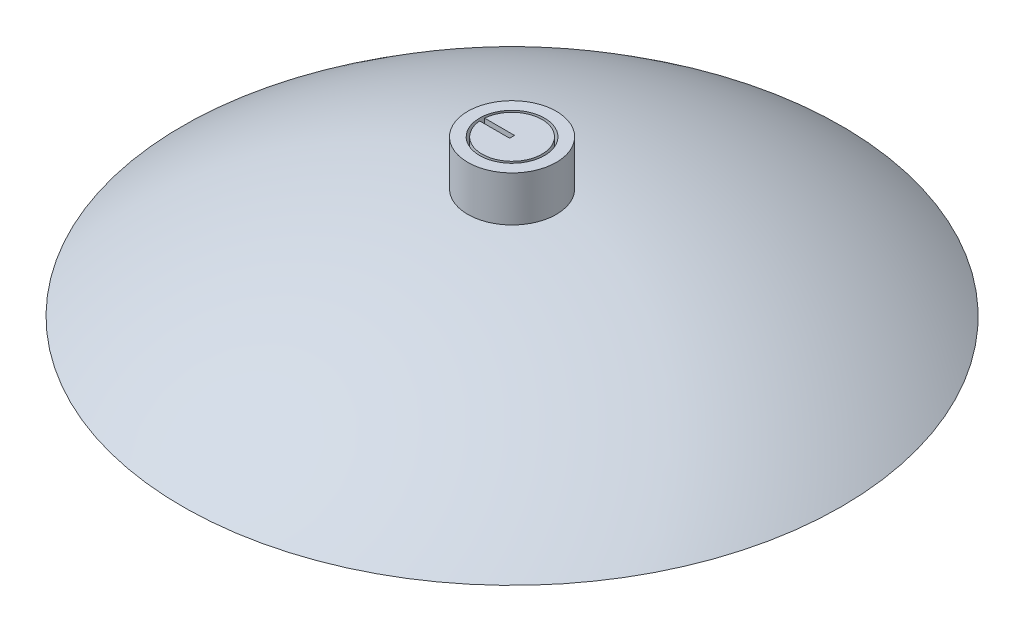
ISO-10303-21;
HEADER;
FILE_DESCRIPTION(('STEP AP214'),'2;1');
FILE_NAME('part.step','',(''),(''),'','','');
FILE_SCHEMA(('AUTOMOTIVE_DESIGN { 1 0 10303 214 1 1 1 1 }'));
ENDSEC;
DATA;
#1=APPLICATION_CONTEXT('core data for automotive mechanical design processes');
#2=APPLICATION_PROTOCOL_DEFINITION('international standard','automotive_design',2000,#1);
#3=PRODUCT_CONTEXT('',#1,'mechanical');
#4=PRODUCT('Part','Part','',(#3));
#5=PRODUCT_RELATED_PRODUCT_CATEGORY('part','',(#4));
#6=PRODUCT_DEFINITION_FORMATION('','',#4);
#7=PRODUCT_DEFINITION_CONTEXT('part definition',#1,'design');
#8=PRODUCT_DEFINITION('design','',#6,#7);
#9=PRODUCT_DEFINITION_SHAPE('','',#8);
#10=(LENGTH_UNIT() NAMED_UNIT(*) SI_UNIT(.MILLI.,.METRE.));
#11=(NAMED_UNIT(*) PLANE_ANGLE_UNIT() SI_UNIT($,.RADIAN.));
#12=(NAMED_UNIT(*) SI_UNIT($,.STERADIAN.) SOLID_ANGLE_UNIT());
#13=UNCERTAINTY_MEASURE_WITH_UNIT(LENGTH_MEASURE(1.E-05),#10,'distance_accuracy_value','');
#14=(GEOMETRIC_REPRESENTATION_CONTEXT(3) GLOBAL_UNCERTAINTY_ASSIGNED_CONTEXT((#13)) GLOBAL_UNIT_ASSIGNED_CONTEXT((#10,
#11,#12)) REPRESENTATION_CONTEXT('',''));
#15=CARTESIAN_POINT('',(0.,0.,0.));
#16=DIRECTION('',(0.,0.,1.));
#17=DIRECTION('',(1.,0.,0.));
#18=AXIS2_PLACEMENT_3D('',#15,#16,#17);
#19=CARTESIAN_POINT('',(0.,-276.361469298246,0.));
#20=DIRECTION('',(0.,1.,0.));
#21=DIRECTION('',(1.,0.,0.));
#22=AXIS2_PLACEMENT_3D('',#19,#20,#21);
#23=SPHERICAL_SURFACE('',#22,348.751469298246);
#24=CARTESIAN_POINT('',(0.,71.2173803354528,0.));
#25=DIRECTION('',(0.,-1.,0.));
#26=DIRECTION('',(0.,0.,-1.));
#27=AXIS2_PLACEMENT_3D('',#24,#25,#26);
#28=CIRCLE('',#27,28.575);
#29=CARTESIAN_POINT('',(28.5749999999997,71.2173803354528,0.));
#30=VERTEX_POINT('',#29);
#31=EDGE_CURVE('E122',#30,#30,#28,.F.);
#32=CARTESIAN_POINT('',(0.,0.,0.));
#33=DIRECTION('',(0.,1.,0.));
#34=DIRECTION('',(0.,0.,1.));
#35=AXIS2_PLACEMENT_3D('',#32,#33,#34);
#36=CIRCLE('',#35,212.725);
#37=CARTESIAN_POINT('',(212.725,0.,0.));
#38=VERTEX_POINT('',#37);
#39=EDGE_CURVE('E46',#38,#38,#36,.T.);
#40=CARTESIAN_POINT('',(28.5749999999997,71.2173803354528,0.));
#41=CARTESIAN_POINT('',(30.6531778594528,71.0465322560719,0.));
#42=CARTESIAN_POINT('',(32.7298230313158,70.8570417837193,0.));
#43=CARTESIAN_POINT('',(36.8793808310399,70.4408464603028,0.));
#44=CARTESIAN_POINT('',(38.9522934589011,70.214141609239,0.));
#45=CARTESIAN_POINT('',(43.0937190018005,69.7235879356326,0.));
#46=CARTESIAN_POINT('',(45.1622319168386,69.45973911309,0.));
#47=CARTESIAN_POINT('',(49.2941926025545,68.894983062168,0.));
#48=CARTESIAN_POINT('',(51.3576403732322,68.5940758337886,0.));
#49=CARTESIAN_POINT('',(55.4788068820728,67.9552995999625,0.));
#50=CARTESIAN_POINT('',(57.5365256202357,67.6174305945159,0.));
#51=CARTESIAN_POINT('',(61.6455720421874,66.9048395573153,0.));
#52=CARTESIAN_POINT('',(63.6968997259762,66.5301175255614,0.));
#53=CARTESIAN_POINT('',(67.7925040673146,65.743940981457,0.));
#54=CARTESIAN_POINT('',(69.836780724864,65.3324864691066,0.));
#55=CARTESIAN_POINT('',(73.9176253120332,64.4729773439427,0.));
#56=CARTESIAN_POINT('',(75.9541932416528,64.0249227311291,0.));
#57=CARTESIAN_POINT('',(80.0189651509447,63.0923575560364,0.));
#58=CARTESIAN_POINT('',(82.0471691306169,62.6078469937572,0.));
#59=CARTESIAN_POINT('',(86.0945606090364,61.6025258008354,0.));
#60=CARTESIAN_POINT('',(88.1137481077837,61.0817151701927,0.));
#61=CARTESIAN_POINT('',(92.1424569942027,60.0039614000942,0.));
#62=CARTESIAN_POINT('',(94.1519783818744,59.4470182606383,0.));
#63=CARTESIAN_POINT('',(98.1607085258635,58.2971786574064,0.));
#64=CARTESIAN_POINT('',(100.159917282181,57.7042821936303,0.));
#65=CARTESIAN_POINT('',(104.147378961047,56.4827266934367,0.));
#66=CARTESIAN_POINT('',(106.135631883597,55.8540676570193,0.));
#67=CARTESIAN_POINT('',(110.100542217318,54.5611892690666,0.));
#68=CARTESIAN_POINT('',(112.07719962849,53.8969699175312,0.));
#69=CARTESIAN_POINT('',(116.018282992453,52.5331845976309,0.));
#70=CARTESIAN_POINT('',(117.982708945244,51.8336186292659,0.));
#71=CARTESIAN_POINT('',(121.898697380652,50.3993651460088,0.));
#72=CARTESIAN_POINT('',(123.850259863269,49.6646776311166,0.));
#73=CARTESIAN_POINT('',(127.739893485077,48.1604174247093,0.));
#74=CARTESIAN_POINT('',(129.677964624269,47.3908447331942,0.));
#75=CARTESIAN_POINT('',(133.539992026529,45.8170617670007,0.));
#76=CARTESIAN_POINT('',(135.463948289596,45.0128514923223,0.));
#77=CARTESIAN_POINT('',(139.297126948064,43.370052097159,0.));
#78=CARTESIAN_POINT('',(141.206349343465,42.5314629766741,0.));
#79=CARTESIAN_POINT('',(145.009446015362,40.8201756879091,0.));
#80=CARTESIAN_POINT('',(146.903320291859,39.947477519629,0.));
#81=CARTESIAN_POINT('',(150.675111412637,38.1682529071359,0.));
#82=CARTESIAN_POINT('',(152.553028256919,37.261726462923,0.));
#83=CARTESIAN_POINT('',(156.29230033392,35.4151369539516,0.));
#84=CARTESIAN_POINT('',(158.15365556664,34.4750738891933,0.));
#85=CARTESIAN_POINT('',(161.859205569501,32.5617135841864,0.));
#86=CARTESIAN_POINT('',(163.703400339641,31.588416343938,0.));
#87=CARTESIAN_POINT('',(167.374036087384,29.6089008254561,0.));
#88=CARTESIAN_POINT('',(169.200477064987,28.6026825472226,0.));
#89=CARTESIAN_POINT('',(172.835017609409,26.5576486816549,0.));
#90=CARTESIAN_POINT('',(174.643117176227,25.5188330943207,0.));
#91=CARTESIAN_POINT('',(178.240393182499,23.4089388278772,0.));
#92=CARTESIAN_POINT('',(180.029569621952,22.3378601487678,0.));
#93=CARTESIAN_POINT('',(183.588423742366,20.1637842924782,0.));
#94=CARTESIAN_POINT('',(185.358101423327,19.060787115298,0.));
#95=CARTESIAN_POINT('',(188.877388678839,16.8232291390114,0.));
#96=CARTESIAN_POINT('',(190.62699825339,15.6886683399049,0.));
#97=CARTESIAN_POINT('',(194.105586367696,13.3883481010035,0.));
#98=CARTESIAN_POINT('',(195.834564907451,12.2225886612086,0.));
#99=CARTESIAN_POINT('',(199.271334799261,9.8602463456022,0.));
#100=CARTESIAN_POINT('',(200.979126151315,8.66366346979066,0.));
#101=CARTESIAN_POINT('',(204.372971816738,6.24005870965359,0.));
#102=CARTESIAN_POINT('',(206.059026130106,5.01303682532807,0.));
#103=CARTESIAN_POINT('',(209.408856781112,2.52895085860626,0.));
#104=CARTESIAN_POINT('',(211.07263311875,1.27188677620999,0.));
#105=CARTESIAN_POINT('',(212.725,0.,0.));
#106=B_SPLINE_CURVE_WITH_KNOTS('',3,(#40,#41,#42,#43,#44,#45,#46,#47,#48,#49,#50,#51,#52,#53,
#54,#55,#56,#57,#58,#59,#60,#61,#62,#63,#64,#65,#66,#67,#68,#69,#70,#71,#72,#73,#74,#75,#76,#77,
#78,#79,#80,#81,#82,#83,#84,#85,#86,#87,#88,#89,#90,#91,#92,#93,#94,#95,#96,#97,#98,#99,#100,
#101,#102,#103,#104,#105),.UNSPECIFIED.,.F.,.F.,(4,2,2,2,2,2,2,2,2,2,2,2,2,2,2,2,2,2,2,2,2,2,2,
2,2,2,2,2,2,2,2,2,4),(0.,6.25548239144599,12.510964782892,18.7664471743381,25.0219295657841,
31.27741195723,37.5328943486761,43.7883767401221,50.0438591315681,56.2993415230141,
62.5548239144601,68.8103063059062,75.0657886973522,81.3212710887981,87.5767534802442,
93.8322358716902,100.087718263136,106.343200654582,112.598683046028,118.854165437474,
125.10964782892,131.365130220366,137.620612611812,143.876095003258,150.131577394704,
156.38705978615,162.642542177596,168.898024569042,175.153506960488,181.408989351934,
187.66447174338,193.919954134826,200.175436526272),.UNSPECIFIED.);
#107=EDGE_CURVE('BSEAM38',#30,#38,#106,.T.);
#108=ORIENTED_EDGE('',*,*,#31,.F.);
#109=ORIENTED_EDGE('',*,*,#39,.T.);
#110=ORIENTED_EDGE('',*,*,#107,.T.);
#111=ORIENTED_EDGE('',*,*,#107,.F.);
#112=EDGE_LOOP('',(#108,#110,#109,#111));
#113=FACE_BOUND('',#112,.T.);
#114=ADVANCED_FACE('F38',(#113),#23,.T.);
#115=CARTESIAN_POINT('',(0.,-297.817589299627,0.));
#116=DIRECTION('',(0.,1.,0.));
#117=DIRECTION('',(0.,0.,1.));
#118=AXIS2_PLACEMENT_3D('',#115,#116,#117);
#119=DEGENERATE_TOROIDAL_SURFACE('',#118,9.66249287717544,348.751469298246,.T.);
#120=CARTESIAN_POINT('',(0.,50.9236017999871,0.));
#121=DIRECTION('',(0.,-1.,0.));
#122=DIRECTION('',(0.,0.,-1.));
#123=AXIS2_PLACEMENT_3D('',#120,#121,#122);
#124=CIRCLE('',#123,6.985);
#125=CARTESIAN_POINT('',(0.,50.9236017999871,6.985));
#126=VERTEX_POINT('',#125);
#127=EDGE_CURVE('E41',#126,#126,#124,.F.);
#128=ORIENTED_EDGE('',*,*,#127,.T.);
#129=EDGE_LOOP('',(#128));
#130=FACE_BOUND('',#129,.T.);
#131=CARTESIAN_POINT('',(0.,0.,0.));
#132=DIRECTION('',(0.,1.,0.));
#133=DIRECTION('',(0.,0.,1.));
#134=AXIS2_PLACEMENT_3D('',#131,#132,#133);
#135=CIRCLE('',#134,191.135);
#136=CARTESIAN_POINT('',(0.,0.,191.135));
#137=VERTEX_POINT('',#136);
#138=EDGE_CURVE('E11',#137,#137,#135,.T.);
#139=ORIENTED_EDGE('',*,*,#138,.F.);
#140=EDGE_LOOP('',(#139));
#141=FACE_BOUND('',#140,.T.);
#142=ADVANCED_FACE('F133',(#130,#141),#119,.F.);
#143=CARTESIAN_POINT('',(212.725,0.,0.));
#144=DIRECTION('',(0.,1.,0.));
#145=DIRECTION('',(0.,0.,1.));
#146=AXIS2_PLACEMENT_3D('',#143,#144,#145);
#147=PLANE('',#146);
#148=ORIENTED_EDGE('',*,*,#39,.F.);
#149=EDGE_LOOP('',(#148));
#150=FACE_BOUND('',#149,.T.);
#151=ORIENTED_EDGE('',*,*,#138,.T.);
#152=EDGE_LOOP('',(#151));
#153=FACE_BOUND('',#152,.T.);
#154=ADVANCED_FACE('F129',(#150,#153),#147,.F.);
#155=CARTESIAN_POINT('',(0.,100.33,0.));
#156=DIRECTION('',(0.,1.,0.));
#157=DIRECTION('',(0.,0.,1.));
#158=AXIS2_PLACEMENT_3D('',#155,#156,#157);
#159=PLANE('',#158);
#160=CARTESIAN_POINT('',(0.,100.33,0.));
#161=DIRECTION('',(0.,1.,0.));
#162=DIRECTION('',(0.,0.,1.));
#163=AXIS2_PLACEMENT_3D('',#160,#161,#162);
#164=CIRCLE('',#163,20.955);
#165=CARTESIAN_POINT('',(0.,100.33,20.955));
#166=VERTEX_POINT('',#165);
#167=EDGE_CURVE('E110',#166,#166,#164,.T.);
#168=ORIENTED_EDGE('',*,*,#167,.F.);
#169=EDGE_LOOP('',(#168));
#170=FACE_BOUND('',#169,.T.);
#171=CARTESIAN_POINT('',(0.,100.33,0.));
#172=DIRECTION('',(0.,1.,0.));
#173=DIRECTION('',(0.,0.,1.));
#174=AXIS2_PLACEMENT_3D('',#171,#172,#173);
#175=CIRCLE('',#174,28.575);
#176=CARTESIAN_POINT('',(0.,100.33,28.575));
#177=VERTEX_POINT('',#176);
#178=EDGE_CURVE('E117',#177,#177,#175,.T.);
#179=ORIENTED_EDGE('',*,*,#178,.T.);
#180=EDGE_LOOP('',(#179));
#181=FACE_BOUND('',#180,.T.);
#182=ADVANCED_FACE('F132',(#170,#181),#159,.T.);
#183=CARTESIAN_POINT('',(0.,-625.113938596491,0.));
#184=DIRECTION('',(0.,1.,0.));
#185=DIRECTION('',(0.,0.,1.));
#186=AXIS2_PLACEMENT_3D('',#183,#184,#185);
#187=CYLINDRICAL_SURFACE('',#186,28.575);
#188=ORIENTED_EDGE('',*,*,#178,.F.);
#189=EDGE_LOOP('',(#188));
#190=FACE_BOUND('',#189,.T.);
#191=ORIENTED_EDGE('',*,*,#31,.T.);
#192=EDGE_LOOP('',(#191));
#193=FACE_BOUND('',#192,.T.);
#194=ADVANCED_FACE('F145',(#190,#193),#187,.T.);
#195=CARTESIAN_POINT('',(0.,-0.001000000000001,0.));
#196=DIRECTION('',(0.,1.,0.));
#197=DIRECTION('',(0.,0.,1.));
#198=AXIS2_PLACEMENT_3D('',#195,#196,#197);
#199=CYLINDRICAL_SURFACE('',#198,20.955);
#200=ORIENTED_EDGE('',*,*,#167,.T.);
#201=EDGE_LOOP('',(#200));
#202=FACE_BOUND('',#201,.T.);
#203=CARTESIAN_POINT('',(0.,71.7598821191662,0.));
#204=DIRECTION('',(0.,-1.,0.));
#205=DIRECTION('',(0.,0.,-1.));
#206=AXIS2_PLACEMENT_3D('',#203,#204,#205);
#207=CIRCLE('',#206,20.955);
#208=CARTESIAN_POINT('',(0.,71.7598821191662,-20.955));
#209=VERTEX_POINT('',#208);
#210=EDGE_CURVE('E109',#209,#209,#207,.F.);
#211=ORIENTED_EDGE('',*,*,#210,.F.);
#212=EDGE_LOOP('',(#211));
#213=FACE_BOUND('',#212,.T.);
#214=ADVANCED_FACE('F148',(#202,#213),#199,.F.);
#215=CARTESIAN_POINT('',(0.,-0.001000000000001,0.));
#216=DIRECTION('',(0.,1.,0.));
#217=DIRECTION('',(0.,0.,1.));
#218=AXIS2_PLACEMENT_3D('',#215,#216,#217);
#219=CYLINDRICAL_SURFACE('',#218,19.3675);
#220=DIRECTION('',(0.,1.,0.));
#221=VECTOR('',#220,1.);
#222=CARTESIAN_POINT('',(-19.3023288750347,-0.001000000000001,1.58750000000001));
#223=LINE('',#222,#221);
#224=CARTESIAN_POINT('',(-19.3023288750347,71.8518091410396,1.58750000000001));
#225=VERTEX_POINT('',#224);
#226=CARTESIAN_POINT('',(-19.3023288750347,100.33,1.58750000000001));
#227=VERTEX_POINT('',#226);
#228=EDGE_CURVE('E62',#225,#227,#223,.T.);
#229=ORIENTED_EDGE('',*,*,#228,.F.);
#230=CARTESIAN_POINT('',(0.,71.8518091410395,0.));
#231=DIRECTION('',(0.,-1.,0.));
#232=DIRECTION('',(0.,0.,-1.));
#233=AXIS2_PLACEMENT_3D('',#230,#231,#232);
#234=CIRCLE('',#233,19.3675);
#235=CARTESIAN_POINT('',(-19.3023288750347,71.8518091410396,-1.5875));
#236=VERTEX_POINT('',#235);
#237=EDGE_CURVE('E95',#225,#236,#234,.F.);
#238=ORIENTED_EDGE('',*,*,#237,.T.);
#239=DIRECTION('',(0.,1.,0.));
#240=VECTOR('',#239,1.);
#241=CARTESIAN_POINT('',(-19.3023288750347,-0.001000000000001,-1.5875));
#242=LINE('',#241,#240);
#243=CARTESIAN_POINT('',(-19.3023288750347,100.33,-1.5875));
#244=VERTEX_POINT('',#243);
#245=EDGE_CURVE('E103',#236,#244,#242,.T.);
#246=ORIENTED_EDGE('',*,*,#245,.T.);
#247=CARTESIAN_POINT('',(0.,100.33,0.));
#248=DIRECTION('',(0.,1.,0.));
#249=DIRECTION('',(0.,0.,1.));
#250=AXIS2_PLACEMENT_3D('',#247,#248,#249);
#251=CIRCLE('',#250,19.3675);
#252=EDGE_CURVE('E113',#227,#244,#251,.T.);
#253=ORIENTED_EDGE('',*,*,#252,.F.);
#254=EDGE_LOOP('',(#229,#238,#246,#253));
#255=FACE_BOUND('',#254,.T.);
#256=ADVANCED_FACE('F156',(#255),#219,.T.);
#257=CARTESIAN_POINT('',(0.,-276.361469298246,0.));
#258=DIRECTION('',(0.,1.,0.));
#259=DIRECTION('',(1.,0.,0.));
#260=AXIS2_PLACEMENT_3D('',#257,#258,#259);
#261=SPHERICAL_SURFACE('',#260,348.751469298246);
#262=ORIENTED_EDGE('',*,*,#210,.T.);
#263=EDGE_LOOP('',(#262));
#264=FACE_BOUND('',#263,.T.);
#265=ORIENTED_EDGE('',*,*,#237,.F.);
#266=CARTESIAN_POINT('',(0.,-276.361469298246,1.5875));
#267=DIRECTION('',(0.,0.,1.));
#268=DIRECTION('',(1.,0.,0.));
#269=AXIS2_PLACEMENT_3D('',#266,#267,#268);
#270=CIRCLE('',#269,348.747856167511);
#271=CARTESIAN_POINT('',(0.,72.3863868692657,1.5875));
#272=VERTEX_POINT('',#271);
#273=EDGE_CURVE('E78',#225,#272,#270,.F.);
#274=ORIENTED_EDGE('',*,*,#273,.T.);
#275=CARTESIAN_POINT('',(0.,-276.361469298246,0.));
#276=DIRECTION('',(1.,0.,0.));
#277=DIRECTION('',(0.,0.,-1.));
#278=AXIS2_PLACEMENT_3D('',#275,#276,#277);
#279=CIRCLE('',#278,348.751469298246);
#280=CARTESIAN_POINT('',(0.,72.3863868692657,-1.5875));
#281=VERTEX_POINT('',#280);
#282=EDGE_CURVE('E82',#272,#281,#279,.F.);
#283=ORIENTED_EDGE('',*,*,#282,.T.);
#284=CARTESIAN_POINT('',(0.,-276.361469298246,-1.5875));
#285=DIRECTION('',(0.,0.,-1.));
#286=DIRECTION('',(-1.,0.,0.));
#287=AXIS2_PLACEMENT_3D('',#284,#285,#286);
#288=CIRCLE('',#287,348.747856167511);
#289=EDGE_CURVE('E102',#281,#236,#288,.F.);
#290=ORIENTED_EDGE('',*,*,#289,.T.);
#291=EDGE_LOOP('',(#265,#274,#283,#290));
#292=FACE_BOUND('',#291,.T.);
#293=ADVANCED_FACE('F93',(#264,#292),#261,.T.);
#294=DIRECTION('',(1.,0.,0.));
#295=VECTOR('',#294,1.);
#296=CARTESIAN_POINT('',(0.,100.33,1.5875));
#297=LINE('',#296,#295);
#298=CARTESIAN_POINT('',(0.,100.33,1.5875));
#299=VERTEX_POINT('',#298);
#300=EDGE_CURVE('E90',#227,#299,#297,.T.);
#301=ORIENTED_EDGE('',*,*,#300,.F.);
#302=ORIENTED_EDGE('',*,*,#252,.T.);
#303=DIRECTION('',(-1.,0.,0.));
#304=VECTOR('',#303,1.);
#305=CARTESIAN_POINT('',(-19.3023288750347,100.33,-1.5875));
#306=LINE('',#305,#304);
#307=CARTESIAN_POINT('',(0.,100.33,-1.5875));
#308=VERTEX_POINT('',#307);
#309=EDGE_CURVE('E96',#308,#244,#306,.T.);
#310=ORIENTED_EDGE('',*,*,#309,.F.);
#311=DIRECTION('',(0.,0.,-1.));
#312=VECTOR('',#311,1.);
#313=CARTESIAN_POINT('',(0.,100.33,-1.5875));
#314=LINE('',#313,#312);
#315=EDGE_CURVE('E53',#299,#308,#314,.T.);
#316=ORIENTED_EDGE('',*,*,#315,.F.);
#317=EDGE_LOOP('',(#301,#302,#310,#316));
#318=FACE_BOUND('',#317,.T.);
#319=ADVANCED_FACE('F153',(#318),#159,.T.);
#320=CARTESIAN_POINT('',(0.,-0.001000000000001,1.5875));
#321=DIRECTION('',(0.,0.,1.));
#322=DIRECTION('',(1.,0.,0.));
#323=AXIS2_PLACEMENT_3D('',#320,#321,#322);
#324=PLANE('',#323);
#325=ORIENTED_EDGE('',*,*,#228,.T.);
#326=ORIENTED_EDGE('',*,*,#300,.T.);
#327=DIRECTION('',(0.,1.,0.));
#328=VECTOR('',#327,1.);
#329=CARTESIAN_POINT('',(0.,-0.001000000000001,1.5875));
#330=LINE('',#329,#328);
#331=EDGE_CURVE('E84',#272,#299,#330,.T.);
#332=ORIENTED_EDGE('',*,*,#331,.F.);
#333=ORIENTED_EDGE('',*,*,#273,.F.);
#334=EDGE_LOOP('',(#325,#326,#332,#333));
#335=FACE_BOUND('',#334,.T.);
#336=ADVANCED_FACE('F89',(#335),#324,.F.);
#337=CARTESIAN_POINT('',(0.,-0.001000000000001,-1.5875));
#338=DIRECTION('',(1.,0.,0.));
#339=DIRECTION('',(0.,0.,-1.));
#340=AXIS2_PLACEMENT_3D('',#337,#338,#339);
#341=PLANE('',#340);
#342=ORIENTED_EDGE('',*,*,#331,.T.);
#343=ORIENTED_EDGE('',*,*,#315,.T.);
#344=DIRECTION('',(0.,1.,0.));
#345=VECTOR('',#344,1.);
#346=CARTESIAN_POINT('',(0.,-0.001000000000001,-1.5875));
#347=LINE('',#346,#345);
#348=EDGE_CURVE('E85',#281,#308,#347,.T.);
#349=ORIENTED_EDGE('',*,*,#348,.F.);
#350=ORIENTED_EDGE('',*,*,#282,.F.);
#351=EDGE_LOOP('',(#342,#343,#349,#350));
#352=FACE_BOUND('',#351,.T.);
#353=ADVANCED_FACE('F83',(#352),#341,.F.);
#354=CARTESIAN_POINT('',(-19.3023288750347,-0.001000000000001,-1.5875));
#355=DIRECTION('',(0.,0.,-1.));
#356=DIRECTION('',(-1.,0.,0.));
#357=AXIS2_PLACEMENT_3D('',#354,#355,#356);
#358=PLANE('',#357);
#359=ORIENTED_EDGE('',*,*,#348,.T.);
#360=ORIENTED_EDGE('',*,*,#309,.T.);
#361=ORIENTED_EDGE('',*,*,#245,.F.);
#362=ORIENTED_EDGE('',*,*,#289,.F.);
#363=EDGE_LOOP('',(#359,#360,#361,#362));
#364=FACE_BOUND('',#363,.T.);
#365=ADVANCED_FACE('F168',(#364),#358,.F.);
#366=CARTESIAN_POINT('',(0.,32.258,0.));
#367=DIRECTION('',(0.,1.,0.));
#368=DIRECTION('',(0.,0.,1.));
#369=AXIS2_PLACEMENT_3D('',#366,#367,#368);
#370=CYLINDRICAL_SURFACE('',#369,6.985);
#371=CARTESIAN_POINT('',(0.,32.258,0.));
#372=DIRECTION('',(0.,1.,0.));
#373=DIRECTION('',(0.,0.,1.));
#374=AXIS2_PLACEMENT_3D('',#371,#372,#373);
#375=CIRCLE('',#374,6.985);
#376=CARTESIAN_POINT('',(0.,32.258,6.985));
#377=VERTEX_POINT('',#376);
#378=EDGE_CURVE('E192',#377,#377,#375,.T.);
#379=CARTESIAN_POINT('',(0.,32.258,6.985));
#380=CARTESIAN_POINT('',(0.,32.4524333520832,6.985));
#381=CARTESIAN_POINT('',(0.,32.6468667041664,6.985));
#382=CARTESIAN_POINT('',(0.,33.0357334083328,6.985));
#383=CARTESIAN_POINT('',(0.,33.230166760416,6.985));
#384=CARTESIAN_POINT('',(0.,33.6190334645824,6.985));
#385=CARTESIAN_POINT('',(0.,33.8134668166656,6.985));
#386=CARTESIAN_POINT('',(0.,34.202333520832,6.985));
#387=CARTESIAN_POINT('',(0.,34.3967668729152,6.985));
#388=CARTESIAN_POINT('',(0.,34.7856335770816,6.985));
#389=CARTESIAN_POINT('',(0.,34.9800669291648,6.985));
#390=CARTESIAN_POINT('',(0.,35.3689336333312,6.985));
#391=CARTESIAN_POINT('',(0.,35.5633669854144,6.985));
#392=CARTESIAN_POINT('',(0.,35.9522336895808,6.985));
#393=CARTESIAN_POINT('',(0.,36.146667041664,6.985));
#394=CARTESIAN_POINT('',(0.,36.5355337458304,6.985));
#395=CARTESIAN_POINT('',(0.,36.7299670979136,6.985));
#396=CARTESIAN_POINT('',(0.,37.11883380208,6.985));
#397=CARTESIAN_POINT('',(0.,37.3132671541632,6.985));
#398=CARTESIAN_POINT('',(0.,37.7021338583296,6.985));
#399=CARTESIAN_POINT('',(0.,37.8965672104128,6.985));
#400=CARTESIAN_POINT('',(0.,38.2854339145792,6.985));
#401=CARTESIAN_POINT('',(0.,38.4798672666624,6.985));
#402=CARTESIAN_POINT('',(0.,38.8687339708288,6.985));
#403=CARTESIAN_POINT('',(0.,39.063167322912,6.985));
#404=CARTESIAN_POINT('',(0.,39.4520340270783,6.985));
#405=CARTESIAN_POINT('',(0.,39.6464673791616,6.985));
#406=CARTESIAN_POINT('',(0.,40.0353340833279,6.985));
#407=CARTESIAN_POINT('',(0.,40.2297674354111,6.985));
#408=CARTESIAN_POINT('',(0.,40.6186341395775,6.985));
#409=CARTESIAN_POINT('',(0.,40.8130674916607,6.985));
#410=CARTESIAN_POINT('',(0.,41.2019341958271,6.985));
#411=CARTESIAN_POINT('',(0.,41.3963675479103,6.985));
#412=CARTESIAN_POINT('',(0.,41.7852342520767,6.985));
#413=CARTESIAN_POINT('',(0.,41.9796676041599,6.985));
#414=CARTESIAN_POINT('',(0.,42.3685343083263,6.985));
#415=CARTESIAN_POINT('',(0.,42.5629676604095,6.985));
#416=CARTESIAN_POINT('',(0.,42.9518343645759,6.985));
#417=CARTESIAN_POINT('',(0.,43.1462677166591,6.985));
#418=CARTESIAN_POINT('',(0.,43.5351344208255,6.985));
#419=CARTESIAN_POINT('',(0.,43.7295677729087,6.985));
#420=CARTESIAN_POINT('',(0.,44.1184344770751,6.985));
#421=CARTESIAN_POINT('',(0.,44.3128678291583,6.985));
#422=CARTESIAN_POINT('',(0.,44.7017345333247,6.985));
#423=CARTESIAN_POINT('',(0.,44.8961678854079,6.985));
#424=CARTESIAN_POINT('',(0.,45.2850345895743,6.985));
#425=CARTESIAN_POINT('',(0.,45.4794679416575,6.985));
#426=CARTESIAN_POINT('',(0.,45.8683346458239,6.985));
#427=CARTESIAN_POINT('',(0.,46.0627679979071,6.985));
#428=CARTESIAN_POINT('',(0.,46.4516347020735,6.985));
#429=CARTESIAN_POINT('',(0.,46.6460680541567,6.985));
#430=CARTESIAN_POINT('',(0.,47.0349347583231,6.985));
#431=CARTESIAN_POINT('',(0.,47.2293681104063,6.985));
#432=CARTESIAN_POINT('',(0.,47.6182348145727,6.985));
#433=CARTESIAN_POINT('',(0.,47.8126681666559,6.985));
#434=CARTESIAN_POINT('',(0.,48.2015348708223,6.985));
#435=CARTESIAN_POINT('',(0.,48.3959682229055,6.985));
#436=CARTESIAN_POINT('',(0.,48.7848349270719,6.985));
#437=CARTESIAN_POINT('',(0.,48.9792682791551,6.985));
#438=CARTESIAN_POINT('',(0.,49.3681349833215,6.985));
#439=CARTESIAN_POINT('',(0.,49.5625683354047,6.985));
#440=CARTESIAN_POINT('',(0.,49.9514350395711,6.985));
#441=CARTESIAN_POINT('',(0.,50.1458683916543,6.985));
#442=CARTESIAN_POINT('',(0.,50.5347350958207,6.985));
#443=CARTESIAN_POINT('',(0.,50.7291684479039,6.985));
#444=CARTESIAN_POINT('',(0.,50.9236017999871,6.985));
#445=B_SPLINE_CURVE_WITH_KNOTS('',3,(#379,#380,#381,#382,#383,#384,#385,#386,#387,#388,#389,
#390,#391,#392,#393,#394,#395,#396,#397,#398,#399,#400,#401,#402,#403,#404,#405,#406,#407,#408,
#409,#410,#411,#412,#413,#414,#415,#416,#417,#418,#419,#420,#421,#422,#423,#424,#425,#426,#427,
#428,#429,#430,#431,#432,#433,#434,#435,#436,#437,#438,#439,#440,#441,#442,#443,#444),
.UNSPECIFIED.,.F.,.F.,(4,2,2,2,2,2,2,2,2,2,2,2,2,2,2,2,2,2,2,2,2,2,2,2,2,2,2,2,2,2,2,2,4),(0.,
0.583300056249597,1.16660011249919,1.74990016874879,2.33320022499839,2.91650028124798,
3.49980033749758,4.08310039374717,4.66640044999677,5.24970050624637,5.83300056249596,
6.41630061874555,6.99960067499515,7.58290073124475,8.16620078749434,8.74950084374394,
9.33280089999353,9.91610095624313,10.4994010124927,11.0827010687423,11.6660011249919,
12.2493011812415,12.8326012374911,13.4159012937407,13.9992013499903,14.5825014062399,
15.1658014624895,15.7491015187391,16.3324015749887,16.9157016312383,17.4990016874879,
18.0823017437375,18.6656017999871),.UNSPECIFIED.);
#446=EDGE_CURVE('BSEAM171',#377,#126,#445,.T.);
#447=ORIENTED_EDGE('',*,*,#378,.T.);
#448=ORIENTED_EDGE('',*,*,#127,.F.);
#449=ORIENTED_EDGE('',*,*,#446,.T.);
#450=ORIENTED_EDGE('',*,*,#446,.F.);
#451=EDGE_LOOP('',(#447,#449,#448,#450));
#452=FACE_BOUND('',#451,.T.);
#453=ADVANCED_FACE('F171',(#452),#370,.T.);
#454=CARTESIAN_POINT('',(0.,32.258,0.));
#455=DIRECTION('',(0.,1.,0.));
#456=DIRECTION('',(0.,0.,1.));
#457=AXIS2_PLACEMENT_3D('',#454,#455,#456);
#458=PLANE('',#457);
#459=CARTESIAN_POINT('',(0.,32.258,0.));
#460=DIRECTION('',(0.,-1.,0.));
#461=DIRECTION('',(0.,0.,-1.));
#462=AXIS2_PLACEMENT_3D('',#459,#460,#461);
#463=CIRCLE('',#462,5.715);
#464=CARTESIAN_POINT('',(0.,32.258,-5.715));
#465=VERTEX_POINT('',#464);
#466=EDGE_CURVE('E193',#465,#465,#463,.T.);
#467=ORIENTED_EDGE('',*,*,#466,.F.);
#468=EDGE_LOOP('',(#467));
#469=FACE_BOUND('',#468,.T.);
#470=ORIENTED_EDGE('',*,*,#378,.F.);
#471=EDGE_LOOP('',(#470));
#472=FACE_BOUND('',#471,.T.);
#473=ADVANCED_FACE('F175',(#469,#472),#458,.F.);
#474=CARTESIAN_POINT('',(0.,48.768,0.));
#475=DIRECTION('',(0.,-1.,0.));
#476=DIRECTION('',(0.,0.,-1.));
#477=AXIS2_PLACEMENT_3D('',#474,#475,#476);
#478=CYLINDRICAL_SURFACE('',#477,5.715);
#479=CARTESIAN_POINT('',(0.,48.768,0.));
#480=DIRECTION('',(0.,-1.,0.));
#481=DIRECTION('',(0.,0.,-1.));
#482=AXIS2_PLACEMENT_3D('',#479,#480,#481);
#483=CIRCLE('',#482,5.715);
#484=CARTESIAN_POINT('',(0.,48.768,-5.715));
#485=VERTEX_POINT('',#484);
#486=EDGE_CURVE('E191',#485,#485,#483,.T.);
#487=ORIENTED_EDGE('',*,*,#486,.F.);
#488=EDGE_LOOP('',(#487));
#489=FACE_BOUND('',#488,.T.);
#490=ORIENTED_EDGE('',*,*,#466,.T.);
#491=EDGE_LOOP('',(#490));
#492=FACE_BOUND('',#491,.T.);
#493=ADVANCED_FACE('F179',(#489,#492),#478,.F.);
#494=CARTESIAN_POINT('',(0.,48.768,0.));
#495=DIRECTION('',(0.,-1.,0.));
#496=DIRECTION('',(0.,0.,-1.));
#497=AXIS2_PLACEMENT_3D('',#494,#495,#496);
#498=PLANE('',#497);
#499=ORIENTED_EDGE('',*,*,#486,.T.);
#500=EDGE_LOOP('',(#499));
#501=FACE_BOUND('',#500,.T.);
#502=ADVANCED_FACE('F183',(#501),#498,.T.);
#503=CLOSED_SHELL('',(#114,#142,#154,#182,#194,#214,#256,#293,#319,#336,#353,#365,#453,#473,
#493,#502));
#504=MANIFOLD_SOLID_BREP('B2',#503);
#505=ADVANCED_BREP_SHAPE_REPRESENTATION('',(#18,#504),#14);
#506=SHAPE_DEFINITION_REPRESENTATION(#9,#505);
ENDSEC;
END-ISO-10303-21;
